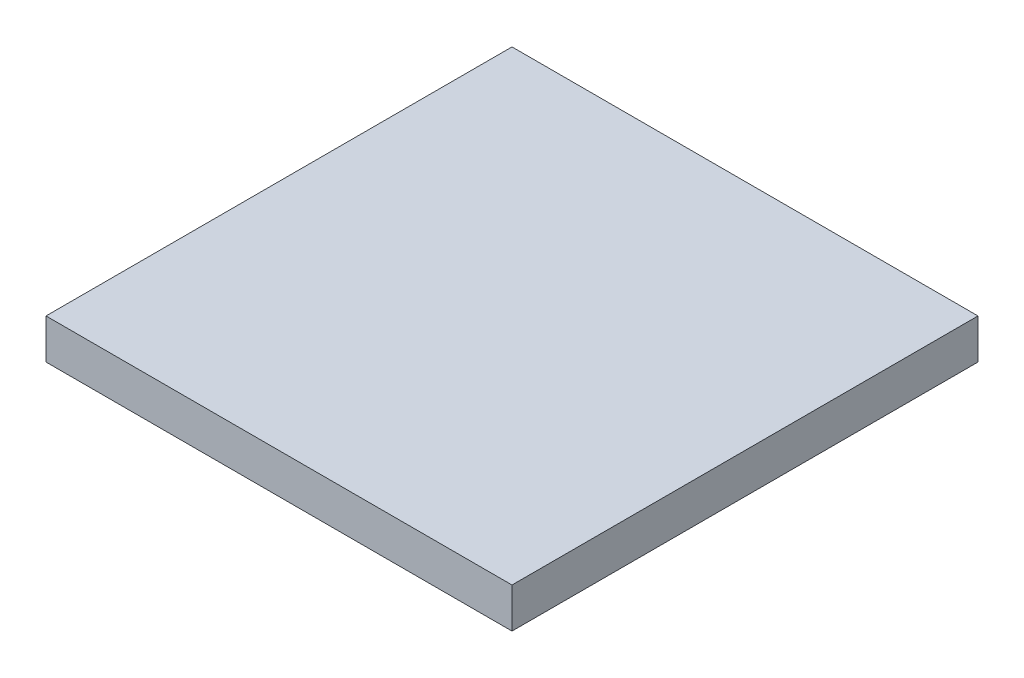
ISO-10303-21;
HEADER;
FILE_DESCRIPTION(('STEP AP214'),'2;1');
FILE_NAME('part.step','',(''),(''),'','','');
FILE_SCHEMA(('AUTOMOTIVE_DESIGN { 1 0 10303 214 1 1 1 1 }'));
ENDSEC;
DATA;
#1=APPLICATION_CONTEXT('core data for automotive mechanical design processes');
#2=APPLICATION_PROTOCOL_DEFINITION('international standard','automotive_design',2000,#1);
#3=PRODUCT_CONTEXT('',#1,'mechanical');
#4=PRODUCT('Part','Part','',(#3));
#5=PRODUCT_RELATED_PRODUCT_CATEGORY('part','',(#4));
#6=PRODUCT_DEFINITION_FORMATION('','',#4);
#7=PRODUCT_DEFINITION_CONTEXT('part definition',#1,'design');
#8=PRODUCT_DEFINITION('design','',#6,#7);
#9=PRODUCT_DEFINITION_SHAPE('','',#8);
#10=(LENGTH_UNIT() NAMED_UNIT(*) SI_UNIT(.MILLI.,.METRE.));
#11=(NAMED_UNIT(*) PLANE_ANGLE_UNIT() SI_UNIT($,.RADIAN.));
#12=(NAMED_UNIT(*) SI_UNIT($,.STERADIAN.) SOLID_ANGLE_UNIT());
#13=UNCERTAINTY_MEASURE_WITH_UNIT(LENGTH_MEASURE(1.E-05),#10,'distance_accuracy_value','');
#14=(GEOMETRIC_REPRESENTATION_CONTEXT(3) GLOBAL_UNCERTAINTY_ASSIGNED_CONTEXT((#13)) GLOBAL_UNIT_ASSIGNED_CONTEXT((#10,
#11,#12)) REPRESENTATION_CONTEXT('',''));
#15=CARTESIAN_POINT('',(0.,0.,0.));
#16=DIRECTION('',(0.,0.,1.));
#17=DIRECTION('',(1.,0.,0.));
#18=AXIS2_PLACEMENT_3D('',#15,#16,#17);
#19=CARTESIAN_POINT('',(-44.8096190023097,1.2,14.2108998294282));
#20=DIRECTION('',(-1.,0.,0.));
#21=DIRECTION('',(0.,0.,1.));
#22=AXIS2_PLACEMENT_3D('',#19,#20,#21);
#23=PLANE('',#22);
#24=DIRECTION('',(0.,0.,-1.));
#25=VECTOR('',#24,1.);
#26=CARTESIAN_POINT('',(-44.8096190023097,0.,14.2108998294282));
#27=LINE('',#26,#25);
#28=CARTESIAN_POINT('',(-44.8096190023097,0.,28.2108998294282));
#29=VERTEX_POINT('',#28);
#30=CARTESIAN_POINT('',(-44.8096190023097,0.,14.2108998294282));
#31=VERTEX_POINT('',#30);
#32=EDGE_CURVE('E96',#29,#31,#27,.T.);
#33=ORIENTED_EDGE('',*,*,#32,.T.);
#34=DIRECTION('',(0.,-1.,0.));
#35=VECTOR('',#34,1.);
#36=CARTESIAN_POINT('',(-44.8096190023097,1.2,14.2108998294282));
#37=LINE('',#36,#35);
#38=CARTESIAN_POINT('',(-44.8096190023097,1.2,14.2108998294282));
#39=VERTEX_POINT('',#38);
#40=EDGE_CURVE('E11',#39,#31,#37,.T.);
#41=ORIENTED_EDGE('',*,*,#40,.F.);
#42=DIRECTION('',(0.,0.,-1.));
#43=VECTOR('',#42,1.);
#44=CARTESIAN_POINT('',(-44.8096190023097,1.2,14.2108998294282));
#45=LINE('',#44,#43);
#46=CARTESIAN_POINT('',(-44.8096190023097,1.2,28.2108998294282));
#47=VERTEX_POINT('',#46);
#48=EDGE_CURVE('E84',#47,#39,#45,.T.);
#49=ORIENTED_EDGE('',*,*,#48,.F.);
#50=DIRECTION('',(0.,-1.,0.));
#51=VECTOR('',#50,1.);
#52=CARTESIAN_POINT('',(-44.8096190023097,1.2,28.2108998294282));
#53=LINE('',#52,#51);
#54=EDGE_CURVE('E92',#47,#29,#53,.T.);
#55=ORIENTED_EDGE('',*,*,#54,.T.);
#56=EDGE_LOOP('',(#33,#41,#49,#55));
#57=FACE_BOUND('',#56,.T.);
#58=ADVANCED_FACE('F33',(#57),#23,.F.);
#59=CARTESIAN_POINT('',(-58.8096190023097,1.2,14.2108998294282));
#60=DIRECTION('',(0.,0.,1.));
#61=DIRECTION('',(1.,0.,0.));
#62=AXIS2_PLACEMENT_3D('',#59,#60,#61);
#63=PLANE('',#62);
#64=DIRECTION('',(-1.,0.,0.));
#65=VECTOR('',#64,1.);
#66=CARTESIAN_POINT('',(-58.8096190023097,0.,14.2108998294282));
#67=LINE('',#66,#65);
#68=CARTESIAN_POINT('',(-58.8096190023097,0.,14.2108998294282));
#69=VERTEX_POINT('',#68);
#70=EDGE_CURVE('E88',#31,#69,#67,.T.);
#71=ORIENTED_EDGE('',*,*,#70,.T.);
#72=DIRECTION('',(0.,-1.,0.));
#73=VECTOR('',#72,1.);
#74=CARTESIAN_POINT('',(-58.8096190023097,1.2,14.2108998294282));
#75=LINE('',#74,#73);
#76=CARTESIAN_POINT('',(-58.8096190023097,1.2,14.2108998294282));
#77=VERTEX_POINT('',#76);
#78=EDGE_CURVE('E41',#77,#69,#75,.T.);
#79=ORIENTED_EDGE('',*,*,#78,.F.);
#80=DIRECTION('',(-1.,0.,0.));
#81=VECTOR('',#80,1.);
#82=CARTESIAN_POINT('',(-58.8096190023097,1.2,14.2108998294282));
#83=LINE('',#82,#81);
#84=EDGE_CURVE('E79',#39,#77,#83,.T.);
#85=ORIENTED_EDGE('',*,*,#84,.F.);
#86=ORIENTED_EDGE('',*,*,#40,.T.);
#87=EDGE_LOOP('',(#71,#79,#85,#86));
#88=FACE_BOUND('',#87,.T.);
#89=ADVANCED_FACE('F87',(#88),#63,.F.);
#90=CARTESIAN_POINT('',(-58.8096190023097,1.2,14.2108998294282));
#91=DIRECTION('',(1.,0.,0.));
#92=DIRECTION('',(0.,0.,-1.));
#93=AXIS2_PLACEMENT_3D('',#90,#91,#92);
#94=PLANE('',#93);
#95=DIRECTION('',(0.,0.,1.));
#96=VECTOR('',#95,1.);
#97=CARTESIAN_POINT('',(-58.8096190023097,0.,14.2108998294282));
#98=LINE('',#97,#96);
#99=CARTESIAN_POINT('',(-58.8096190023097,0.,28.2108998294282));
#100=VERTEX_POINT('',#99);
#101=EDGE_CURVE('E66',#69,#100,#98,.T.);
#102=ORIENTED_EDGE('',*,*,#101,.T.);
#103=DIRECTION('',(0.,-1.,0.));
#104=VECTOR('',#103,1.);
#105=CARTESIAN_POINT('',(-58.8096190023097,1.2,28.2108998294282));
#106=LINE('',#105,#104);
#107=CARTESIAN_POINT('',(-58.8096190023097,1.2,28.2108998294282));
#108=VERTEX_POINT('',#107);
#109=EDGE_CURVE('E89',#108,#100,#106,.T.);
#110=ORIENTED_EDGE('',*,*,#109,.F.);
#111=DIRECTION('',(0.,0.,1.));
#112=VECTOR('',#111,1.);
#113=CARTESIAN_POINT('',(-58.8096190023097,1.2,14.2108998294282));
#114=LINE('',#113,#112);
#115=EDGE_CURVE('E82',#77,#108,#114,.T.);
#116=ORIENTED_EDGE('',*,*,#115,.F.);
#117=ORIENTED_EDGE('',*,*,#78,.T.);
#118=EDGE_LOOP('',(#102,#110,#116,#117));
#119=FACE_BOUND('',#118,.T.);
#120=ADVANCED_FACE('F90',(#119),#94,.F.);
#121=CARTESIAN_POINT('',(-58.8096190023097,1.2,28.2108998294282));
#122=DIRECTION('',(0.,0.,-1.));
#123=DIRECTION('',(-1.,0.,0.));
#124=AXIS2_PLACEMENT_3D('',#121,#122,#123);
#125=PLANE('',#124);
#126=DIRECTION('',(1.,0.,0.));
#127=VECTOR('',#126,1.);
#128=CARTESIAN_POINT('',(-58.8096190023097,0.,28.2108998294282));
#129=LINE('',#128,#127);
#130=EDGE_CURVE('E72',#100,#29,#129,.T.);
#131=ORIENTED_EDGE('',*,*,#130,.T.);
#132=ORIENTED_EDGE('',*,*,#54,.F.);
#133=DIRECTION('',(1.,0.,0.));
#134=VECTOR('',#133,1.);
#135=CARTESIAN_POINT('',(-58.8096190023097,1.2,28.2108998294282));
#136=LINE('',#135,#134);
#137=EDGE_CURVE('E49',#108,#47,#136,.T.);
#138=ORIENTED_EDGE('',*,*,#137,.F.);
#139=ORIENTED_EDGE('',*,*,#109,.T.);
#140=EDGE_LOOP('',(#131,#132,#138,#139));
#141=FACE_BOUND('',#140,.T.);
#142=ADVANCED_FACE('F103',(#141),#125,.F.);
#143=CARTESIAN_POINT('',(0.,1.2,0.));
#144=DIRECTION('',(0.,1.,0.));
#145=DIRECTION('',(0.,0.,1.));
#146=AXIS2_PLACEMENT_3D('',#143,#144,#145);
#147=PLANE('',#146);
#148=ORIENTED_EDGE('',*,*,#48,.T.);
#149=ORIENTED_EDGE('',*,*,#84,.T.);
#150=ORIENTED_EDGE('',*,*,#115,.T.);
#151=ORIENTED_EDGE('',*,*,#137,.T.);
#152=EDGE_LOOP('',(#148,#149,#150,#151));
#153=FACE_BOUND('',#152,.T.);
#154=ADVANCED_FACE('F80',(#153),#147,.T.);
#155=CARTESIAN_POINT('',(0.,0.,0.));
#156=DIRECTION('',(0.,1.,0.));
#157=DIRECTION('',(0.,0.,1.));
#158=AXIS2_PLACEMENT_3D('',#155,#156,#157);
#159=PLANE('',#158);
#160=ORIENTED_EDGE('',*,*,#32,.F.);
#161=ORIENTED_EDGE('',*,*,#130,.F.);
#162=ORIENTED_EDGE('',*,*,#101,.F.);
#163=ORIENTED_EDGE('',*,*,#70,.F.);
#164=EDGE_LOOP('',(#160,#161,#162,#163));
#165=FACE_BOUND('',#164,.T.);
#166=ADVANCED_FACE('F106',(#165),#159,.F.);
#167=CLOSED_SHELL('',(#58,#89,#120,#142,#154,#166));
#168=MANIFOLD_SOLID_BREP('B2',#167);
#169=ADVANCED_BREP_SHAPE_REPRESENTATION('',(#18,#168),#14);
#170=SHAPE_DEFINITION_REPRESENTATION(#9,#169);
ENDSEC;
END-ISO-10303-21;
